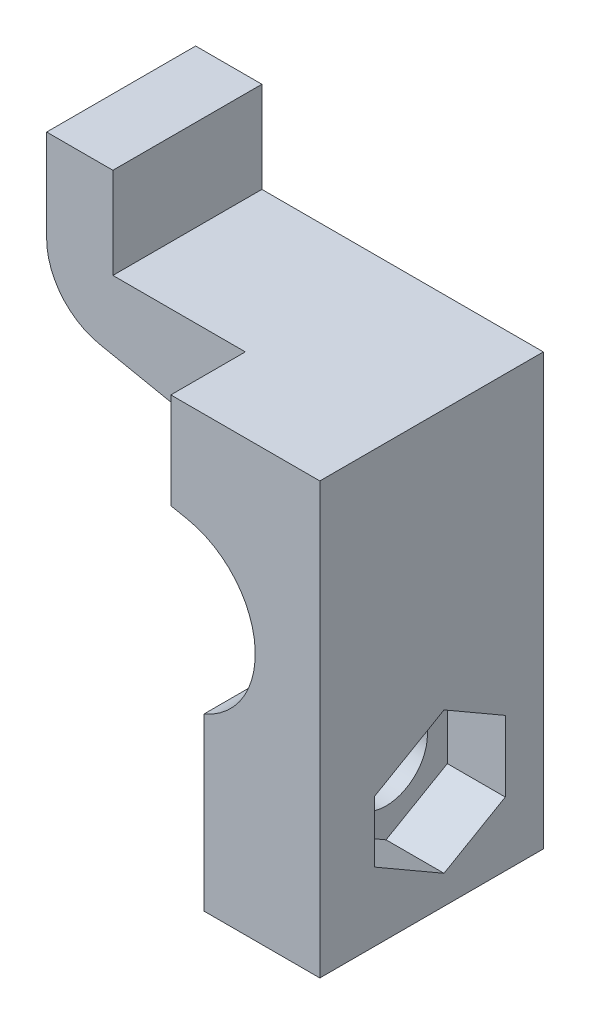
ISO-10303-21;
HEADER;
FILE_DESCRIPTION(('STEP AP214'),'2;1');
FILE_NAME('part.step','',(''),(''),'','','');
FILE_SCHEMA(('AUTOMOTIVE_DESIGN { 1 0 10303 214 1 1 1 1 }'));
ENDSEC;
DATA;
#1=APPLICATION_CONTEXT('core data for automotive mechanical design processes');
#2=APPLICATION_PROTOCOL_DEFINITION('international standard','automotive_design',2000,#1);
#3=PRODUCT_CONTEXT('',#1,'mechanical');
#4=PRODUCT('Part','Part','',(#3));
#5=PRODUCT_RELATED_PRODUCT_CATEGORY('part','',(#4));
#6=PRODUCT_DEFINITION_FORMATION('','',#4);
#7=PRODUCT_DEFINITION_CONTEXT('part definition',#1,'design');
#8=PRODUCT_DEFINITION('design','',#6,#7);
#9=PRODUCT_DEFINITION_SHAPE('','',#8);
#10=(LENGTH_UNIT() NAMED_UNIT(*) SI_UNIT(.MILLI.,.METRE.));
#11=(NAMED_UNIT(*) PLANE_ANGLE_UNIT() SI_UNIT($,.RADIAN.));
#12=(NAMED_UNIT(*) SI_UNIT($,.STERADIAN.) SOLID_ANGLE_UNIT());
#13=UNCERTAINTY_MEASURE_WITH_UNIT(LENGTH_MEASURE(1.E-05),#10,'distance_accuracy_value','');
#14=(GEOMETRIC_REPRESENTATION_CONTEXT(3) GLOBAL_UNCERTAINTY_ASSIGNED_CONTEXT((#13)) GLOBAL_UNIT_ASSIGNED_CONTEXT((#10,
#11,#12)) REPRESENTATION_CONTEXT('',''));
#15=CARTESIAN_POINT('',(0.,0.,0.));
#16=DIRECTION('',(0.,0.,1.));
#17=DIRECTION('',(1.,0.,0.));
#18=AXIS2_PLACEMENT_3D('',#15,#16,#17);
#19=CARTESIAN_POINT('',(0.,-25.5,6.));
#20=DIRECTION('',(1.,0.,0.));
#21=DIRECTION('',(0.,0.,-1.));
#22=AXIS2_PLACEMENT_3D('',#19,#20,#21);
#23=CYLINDRICAL_SURFACE('',#22,2.5);
#24=CARTESIAN_POINT('',(14.,-25.5,6.));
#25=DIRECTION('',(1.,0.,0.));
#26=DIRECTION('',(0.,1.,0.));
#27=AXIS2_PLACEMENT_3D('',#24,#25,#26);
#28=CIRCLE('',#27,2.5);
#29=CARTESIAN_POINT('',(14.,-25.5,3.5));
#30=VERTEX_POINT('',#29);
#31=EDGE_CURVE('E242',#30,#30,#28,.T.);
#32=CARTESIAN_POINT('',(17.5,-25.5,6.));
#33=DIRECTION('',(1.,0.,0.));
#34=DIRECTION('',(0.,0.,-1.));
#35=AXIS2_PLACEMENT_3D('',#32,#33,#34);
#36=CIRCLE('',#35,2.5);
#37=CARTESIAN_POINT('',(17.5,-25.5,3.5));
#38=VERTEX_POINT('',#37);
#39=EDGE_CURVE('E41',#38,#38,#36,.F.);
#40=CARTESIAN_POINT('',(14.,-25.5,3.5));
#41=CARTESIAN_POINT('',(14.0364583333333,-25.5,3.5));
#42=CARTESIAN_POINT('',(14.0729166666667,-25.5,3.5));
#43=CARTESIAN_POINT('',(14.1458333333333,-25.5,3.5));
#44=CARTESIAN_POINT('',(14.1822916666667,-25.5,3.5));
#45=CARTESIAN_POINT('',(14.2552083333333,-25.5,3.5));
#46=CARTESIAN_POINT('',(14.2916666666667,-25.5,3.5));
#47=CARTESIAN_POINT('',(14.3645833333333,-25.5,3.5));
#48=CARTESIAN_POINT('',(14.4010416666667,-25.5,3.5));
#49=CARTESIAN_POINT('',(14.4739583333333,-25.5,3.5));
#50=CARTESIAN_POINT('',(14.5104166666667,-25.5,3.5));
#51=CARTESIAN_POINT('',(14.5833333333333,-25.5,3.5));
#52=CARTESIAN_POINT('',(14.6197916666667,-25.5,3.5));
#53=CARTESIAN_POINT('',(14.6927083333333,-25.5,3.5));
#54=CARTESIAN_POINT('',(14.7291666666667,-25.5,3.5));
#55=CARTESIAN_POINT('',(14.8020833333333,-25.5,3.5));
#56=CARTESIAN_POINT('',(14.8385416666667,-25.5,3.5));
#57=CARTESIAN_POINT('',(14.9114583333333,-25.5,3.5));
#58=CARTESIAN_POINT('',(14.9479166666667,-25.5,3.5));
#59=CARTESIAN_POINT('',(15.0208333333333,-25.5,3.5));
#60=CARTESIAN_POINT('',(15.0572916666667,-25.5,3.5));
#61=CARTESIAN_POINT('',(15.1302083333333,-25.5,3.5));
#62=CARTESIAN_POINT('',(15.1666666666667,-25.5,3.5));
#63=CARTESIAN_POINT('',(15.2395833333333,-25.5,3.5));
#64=CARTESIAN_POINT('',(15.2760416666667,-25.5,3.5));
#65=CARTESIAN_POINT('',(15.3489583333333,-25.5,3.5));
#66=CARTESIAN_POINT('',(15.3854166666667,-25.5,3.5));
#67=CARTESIAN_POINT('',(15.4583333333333,-25.5,3.5));
#68=CARTESIAN_POINT('',(15.4947916666667,-25.5,3.5));
#69=CARTESIAN_POINT('',(15.5677083333333,-25.5,3.5));
#70=CARTESIAN_POINT('',(15.6041666666667,-25.5,3.5));
#71=CARTESIAN_POINT('',(15.6770833333333,-25.5,3.5));
#72=CARTESIAN_POINT('',(15.7135416666667,-25.5,3.5));
#73=CARTESIAN_POINT('',(15.7864583333333,-25.5,3.5));
#74=CARTESIAN_POINT('',(15.8229166666667,-25.5,3.5));
#75=CARTESIAN_POINT('',(15.8958333333333,-25.5,3.5));
#76=CARTESIAN_POINT('',(15.9322916666667,-25.5,3.5));
#77=CARTESIAN_POINT('',(16.0052083333333,-25.5,3.5));
#78=CARTESIAN_POINT('',(16.0416666666667,-25.5,3.5));
#79=CARTESIAN_POINT('',(16.1145833333333,-25.5,3.5));
#80=CARTESIAN_POINT('',(16.1510416666667,-25.5,3.5));
#81=CARTESIAN_POINT('',(16.2239583333333,-25.5,3.5));
#82=CARTESIAN_POINT('',(16.2604166666667,-25.5,3.5));
#83=CARTESIAN_POINT('',(16.3333333333333,-25.5,3.5));
#84=CARTESIAN_POINT('',(16.3697916666667,-25.5,3.5));
#85=CARTESIAN_POINT('',(16.4427083333333,-25.5,3.5));
#86=CARTESIAN_POINT('',(16.4791666666667,-25.5,3.5));
#87=CARTESIAN_POINT('',(16.5520833333333,-25.5,3.5));
#88=CARTESIAN_POINT('',(16.5885416666667,-25.5,3.5));
#89=CARTESIAN_POINT('',(16.6614583333333,-25.5,3.5));
#90=CARTESIAN_POINT('',(16.6979166666667,-25.5,3.5));
#91=CARTESIAN_POINT('',(16.7708333333333,-25.5,3.5));
#92=CARTESIAN_POINT('',(16.8072916666667,-25.5,3.5));
#93=CARTESIAN_POINT('',(16.8802083333333,-25.5,3.5));
#94=CARTESIAN_POINT('',(16.9166666666667,-25.5,3.5));
#95=CARTESIAN_POINT('',(16.9895833333333,-25.5,3.5));
#96=CARTESIAN_POINT('',(17.0260416666667,-25.5,3.5));
#97=CARTESIAN_POINT('',(17.0989583333333,-25.5,3.5));
#98=CARTESIAN_POINT('',(17.1354166666667,-25.5,3.5));
#99=CARTESIAN_POINT('',(17.2083333333333,-25.5,3.5));
#100=CARTESIAN_POINT('',(17.2447916666667,-25.5,3.5));
#101=CARTESIAN_POINT('',(17.3177083333333,-25.5,3.5));
#102=CARTESIAN_POINT('',(17.3541666666667,-25.5,3.5));
#103=CARTESIAN_POINT('',(17.4270833333333,-25.5,3.5));
#104=CARTESIAN_POINT('',(17.4635416666667,-25.5,3.5));
#105=CARTESIAN_POINT('',(17.5,-25.5,3.5));
#106=B_SPLINE_CURVE_WITH_KNOTS('',3,(#40,#41,#42,#43,#44,#45,#46,#47,#48,#49,#50,#51,#52,#53,
#54,#55,#56,#57,#58,#59,#60,#61,#62,#63,#64,#65,#66,#67,#68,#69,#70,#71,#72,#73,#74,#75,#76,#77,
#78,#79,#80,#81,#82,#83,#84,#85,#86,#87,#88,#89,#90,#91,#92,#93,#94,#95,#96,#97,#98,#99,#100,
#101,#102,#103,#104,#105),.UNSPECIFIED.,.F.,.F.,(4,2,2,2,2,2,2,2,2,2,2,2,2,2,2,2,2,2,2,2,2,2,2,
2,2,2,2,2,2,2,2,2,4),(0.,0.109375,0.21875,0.328125,0.4375,0.546875,0.656250000000001,
0.765625000000001,0.875000000000001,0.984374999999999,1.09375,1.203125,1.3125,1.421875,1.53125,
1.640625,1.75,1.859375,1.96875,2.078125,2.1875,2.296875,2.40625,2.515625,2.625,2.734375,2.84375,
2.953125,3.0625,3.171875,3.28125,3.390625,3.5),.UNSPECIFIED.);
#107=EDGE_CURVE('BSEAM37',#30,#38,#106,.T.);
#108=ORIENTED_EDGE('',*,*,#31,.F.);
#109=ORIENTED_EDGE('',*,*,#39,.F.);
#110=ORIENTED_EDGE('',*,*,#107,.T.);
#111=ORIENTED_EDGE('',*,*,#107,.F.);
#112=EDGE_LOOP('',(#108,#110,#109,#111));
#113=FACE_BOUND('',#112,.T.);
#114=ADVANCED_FACE('F37',(#113),#23,.F.);
#115=CARTESIAN_POINT('',(4.,0.,9.));
#116=DIRECTION('',(0.,-1.,0.));
#117=DIRECTION('',(1.,0.,0.));
#118=AXIS2_PLACEMENT_3D('',#115,#116,#117);
#119=PLANE('',#118);
#120=DIRECTION('',(-1.,0.,0.));
#121=VECTOR('',#120,1.);
#122=CARTESIAN_POINT('',(4.,0.,0.));
#123=LINE('',#122,#121);
#124=CARTESIAN_POINT('',(4.,0.,0.));
#125=VERTEX_POINT('',#124);
#126=CARTESIAN_POINT('',(0.,0.,0.));
#127=VERTEX_POINT('',#126);
#128=EDGE_CURVE('E260',#125,#127,#123,.T.);
#129=ORIENTED_EDGE('',*,*,#128,.T.);
#130=DIRECTION('',(0.,0.,-1.));
#131=VECTOR('',#130,1.);
#132=CARTESIAN_POINT('',(0.,0.,9.));
#133=LINE('',#132,#131);
#134=CARTESIAN_POINT('',(0.,0.,9.));
#135=VERTEX_POINT('',#134);
#136=EDGE_CURVE('E11',#135,#127,#133,.T.);
#137=ORIENTED_EDGE('',*,*,#136,.F.);
#138=DIRECTION('',(-1.,0.,0.));
#139=VECTOR('',#138,1.);
#140=CARTESIAN_POINT('',(4.,0.,9.));
#141=LINE('',#140,#139);
#142=CARTESIAN_POINT('',(4.,0.,9.));
#143=VERTEX_POINT('',#142);
#144=EDGE_CURVE('E290',#143,#135,#141,.T.);
#145=ORIENTED_EDGE('',*,*,#144,.F.);
#146=DIRECTION('',(0.,0.,-1.));
#147=VECTOR('',#146,1.);
#148=CARTESIAN_POINT('',(4.,0.,9.));
#149=LINE('',#148,#147);
#150=EDGE_CURVE('E291',#143,#125,#149,.T.);
#151=ORIENTED_EDGE('',*,*,#150,.T.);
#152=EDGE_LOOP('',(#129,#137,#145,#151));
#153=FACE_BOUND('',#152,.T.);
#154=ADVANCED_FACE('F39',(#153),#119,.F.);
#155=CARTESIAN_POINT('',(0.,0.,9.));
#156=DIRECTION('',(1.,0.,0.));
#157=DIRECTION('',(0.,0.,-1.));
#158=AXIS2_PLACEMENT_3D('',#155,#156,#157);
#159=PLANE('',#158);
#160=DIRECTION('',(0.,-1.,0.));
#161=VECTOR('',#160,1.);
#162=CARTESIAN_POINT('',(0.,0.,0.));
#163=LINE('',#162,#161);
#164=CARTESIAN_POINT('',(0.,-5.58071066567437,0.));
#165=VERTEX_POINT('',#164);
#166=EDGE_CURVE('E264',#127,#165,#163,.T.);
#167=ORIENTED_EDGE('',*,*,#166,.T.);
#168=DIRECTION('',(0.,0.,-1.));
#169=VECTOR('',#168,1.);
#170=CARTESIAN_POINT('',(0.,-5.58071066567437,9.));
#171=LINE('',#170,#169);
#172=CARTESIAN_POINT('',(0.,-5.58071066567437,9.));
#173=VERTEX_POINT('',#172);
#174=EDGE_CURVE('E46',#173,#165,#171,.T.);
#175=ORIENTED_EDGE('',*,*,#174,.F.);
#176=DIRECTION('',(0.,-1.,0.));
#177=VECTOR('',#176,1.);
#178=CARTESIAN_POINT('',(0.,0.,9.));
#179=LINE('',#178,#177);
#180=EDGE_CURVE('E322',#135,#173,#179,.T.);
#181=ORIENTED_EDGE('',*,*,#180,.F.);
#182=ORIENTED_EDGE('',*,*,#136,.T.);
#183=EDGE_LOOP('',(#167,#175,#181,#182));
#184=FACE_BOUND('',#183,.T.);
#185=ADVANCED_FACE('F330',(#184),#159,.F.);
#186=CARTESIAN_POINT('',(4.,-5.58071066567437,9.));
#187=DIRECTION('',(0.,0.,-1.));
#188=DIRECTION('',(-1.,0.,0.));
#189=AXIS2_PLACEMENT_3D('',#186,#187,#188);
#190=CYLINDRICAL_SURFACE('',#189,4.);
#191=CARTESIAN_POINT('',(4.,-5.58071066567437,0.));
#192=DIRECTION('',(0.,0.,1.));
#193=DIRECTION('',(1.,0.,0.));
#194=AXIS2_PLACEMENT_3D('',#191,#192,#193);
#195=CIRCLE('',#194,4.);
#196=CARTESIAN_POINT('',(3.20051822169524,-9.5,0.));
#197=VERTEX_POINT('',#196);
#198=EDGE_CURVE('E270',#165,#197,#195,.T.);
#199=ORIENTED_EDGE('',*,*,#198,.T.);
#200=DIRECTION('',(0.,0.,-1.));
#201=VECTOR('',#200,1.);
#202=CARTESIAN_POINT('',(3.20051822169524,-9.5,9.));
#203=LINE('',#202,#201);
#204=CARTESIAN_POINT('',(3.20051822169524,-9.5,9.));
#205=VERTEX_POINT('',#204);
#206=EDGE_CURVE('E311',#205,#197,#203,.T.);
#207=ORIENTED_EDGE('',*,*,#206,.F.);
#208=CARTESIAN_POINT('',(4.,-5.58071066567437,9.));
#209=DIRECTION('',(0.,0.,1.));
#210=DIRECTION('',(1.,0.,0.));
#211=AXIS2_PLACEMENT_3D('',#208,#209,#210);
#212=CIRCLE('',#211,4.);
#213=EDGE_CURVE('E317',#173,#205,#212,.T.);
#214=ORIENTED_EDGE('',*,*,#213,.F.);
#215=ORIENTED_EDGE('',*,*,#174,.T.);
#216=EDGE_LOOP('',(#199,#207,#214,#215));
#217=FACE_BOUND('',#216,.T.);
#218=ADVANCED_FACE('F335',(#217),#190,.T.);
#219=CARTESIAN_POINT('',(3.20051822169524,-9.5,9.));
#220=DIRECTION('',(0.19987044457619,0.979822333581408,0.));
#221=DIRECTION('',(-0.979822333581408,0.19987044457619,0.));
#222=AXIS2_PLACEMENT_3D('',#219,#220,#221);
#223=PLANE('',#222);
#224=DIRECTION('',(0.979822333581408,-0.19987044457619,0.));
#225=VECTOR('',#224,1.);
#226=CARTESIAN_POINT('',(3.20051822169524,-9.5,0.));
#227=LINE('',#226,#225);
#228=CARTESIAN_POINT('',(13.0193392673386,-11.5029060987348,0.));
#229=VERTEX_POINT('',#228);
#230=EDGE_CURVE('E276',#197,#229,#227,.T.);
#231=ORIENTED_EDGE('',*,*,#230,.T.);
#232=DIRECTION('',(0.,0.,-1.));
#233=VECTOR('',#232,1.);
#234=CARTESIAN_POINT('',(13.0193392673386,-11.5029060987348,9.));
#235=LINE('',#234,#233);
#236=CARTESIAN_POINT('',(13.0193392673386,-11.5029060987348,13.5));
#237=VERTEX_POINT('',#236);
#238=EDGE_CURVE('E308',#237,#229,#235,.T.);
#239=ORIENTED_EDGE('',*,*,#238,.F.);
#240=DIRECTION('',(0.979822333581408,-0.199870444576192,0.));
#241=VECTOR('',#240,1.);
#242=CARTESIAN_POINT('',(12.,-11.2949747365334,13.5));
#243=LINE('',#242,#241);
#244=CARTESIAN_POINT('',(12.,-11.2949747365334,13.5));
#245=VERTEX_POINT('',#244);
#246=EDGE_CURVE('E224',#245,#237,#243,.T.);
#247=ORIENTED_EDGE('',*,*,#246,.F.);
#248=DIRECTION('',(0.,0.,-1.));
#249=VECTOR('',#248,1.);
#250=CARTESIAN_POINT('',(12.,-11.2949747365334,13.5));
#251=LINE('',#250,#249);
#252=CARTESIAN_POINT('',(12.,-11.2949747365334,9.));
#253=VERTEX_POINT('',#252);
#254=EDGE_CURVE('E239',#245,#253,#251,.T.);
#255=ORIENTED_EDGE('',*,*,#254,.T.);
#256=DIRECTION('',(0.979822333581408,-0.19987044457619,0.));
#257=VECTOR('',#256,1.);
#258=CARTESIAN_POINT('',(3.20051822169524,-9.5,9.));
#259=LINE('',#258,#257);
#260=EDGE_CURVE('E315',#205,#253,#259,.T.);
#261=ORIENTED_EDGE('',*,*,#260,.F.);
#262=ORIENTED_EDGE('',*,*,#206,.T.);
#263=EDGE_LOOP('',(#231,#239,#247,#255,#261,#262));
#264=FACE_BOUND('',#263,.T.);
#265=ADVANCED_FACE('F341',(#264),#223,.F.);
#266=CARTESIAN_POINT('',(12.,-16.5,9.));
#267=DIRECTION('',(0.,0.,-1.));
#268=DIRECTION('',(-1.,0.,0.));
#269=AXIS2_PLACEMENT_3D('',#266,#267,#268);
#270=CYLINDRICAL_SURFACE('',#269,5.1);
#271=CARTESIAN_POINT('',(12.,-16.5,0.));
#272=DIRECTION('',(0.,0.,-1.));
#273=DIRECTION('',(1.,0.,0.));
#274=AXIS2_PLACEMENT_3D('',#271,#272,#273);
#275=CIRCLE('',#274,5.1);
#276=CARTESIAN_POINT('',(14.,-21.191481642296,0.));
#277=VERTEX_POINT('',#276);
#278=EDGE_CURVE('E278',#229,#277,#275,.T.);
#279=ORIENTED_EDGE('',*,*,#278,.T.);
#280=DIRECTION('',(0.,0.,-1.));
#281=VECTOR('',#280,1.);
#282=CARTESIAN_POINT('',(14.,-21.191481642296,9.));
#283=LINE('',#282,#281);
#284=CARTESIAN_POINT('',(14.,-21.191481642296,13.5));
#285=VERTEX_POINT('',#284);
#286=EDGE_CURVE('E305',#285,#277,#283,.T.);
#287=ORIENTED_EDGE('',*,*,#286,.F.);
#288=CARTESIAN_POINT('',(12.,-16.5,13.5));
#289=DIRECTION('',(0.,0.,-1.));
#290=DIRECTION('',(1.,0.,0.));
#291=AXIS2_PLACEMENT_3D('',#288,#289,#290);
#292=CIRCLE('',#291,5.1);
#293=EDGE_CURVE('E227',#237,#285,#292,.T.);
#294=ORIENTED_EDGE('',*,*,#293,.F.);
#295=ORIENTED_EDGE('',*,*,#238,.T.);
#296=EDGE_LOOP('',(#279,#287,#294,#295));
#297=FACE_BOUND('',#296,.T.);
#298=ADVANCED_FACE('F347',(#297),#270,.F.);
#299=CARTESIAN_POINT('',(14.,-21.191481642296,9.));
#300=DIRECTION('',(1.,0.,0.));
#301=DIRECTION('',(0.,1.,0.));
#302=AXIS2_PLACEMENT_3D('',#299,#300,#301);
#303=PLANE('',#302);
#304=ORIENTED_EDGE('',*,*,#31,.T.);
#305=EDGE_LOOP('',(#304));
#306=FACE_BOUND('',#305,.T.);
#307=DIRECTION('',(0.,-1.,0.));
#308=VECTOR('',#307,1.);
#309=CARTESIAN_POINT('',(14.,-21.191481642296,0.));
#310=LINE('',#309,#308);
#311=CARTESIAN_POINT('',(14.,-31.5,0.));
#312=VERTEX_POINT('',#311);
#313=EDGE_CURVE('E280',#277,#312,#310,.T.);
#314=ORIENTED_EDGE('',*,*,#313,.T.);
#315=DIRECTION('',(0.,0.,-1.));
#316=VECTOR('',#315,1.);
#317=CARTESIAN_POINT('',(14.,-31.5,9.));
#318=LINE('',#317,#316);
#319=CARTESIAN_POINT('',(14.,-31.5,13.5));
#320=VERTEX_POINT('',#319);
#321=EDGE_CURVE('E302',#320,#312,#318,.T.);
#322=ORIENTED_EDGE('',*,*,#321,.F.);
#323=DIRECTION('',(0.,-1.,0.));
#324=VECTOR('',#323,1.);
#325=CARTESIAN_POINT('',(14.,-21.191481642296,13.5));
#326=LINE('',#325,#324);
#327=EDGE_CURVE('E230',#285,#320,#326,.T.);
#328=ORIENTED_EDGE('',*,*,#327,.F.);
#329=ORIENTED_EDGE('',*,*,#286,.T.);
#330=EDGE_LOOP('',(#314,#322,#328,#329));
#331=FACE_BOUND('',#330,.T.);
#332=ADVANCED_FACE('F351',(#306,#331),#303,.F.);
#333=CARTESIAN_POINT('',(14.,-31.5,9.));
#334=DIRECTION('',(0.,1.,0.));
#335=DIRECTION('',(0.,0.,1.));
#336=AXIS2_PLACEMENT_3D('',#333,#334,#335);
#337=PLANE('',#336);
#338=DIRECTION('',(1.,0.,0.));
#339=VECTOR('',#338,1.);
#340=CARTESIAN_POINT('',(14.,-31.5,0.));
#341=LINE('',#340,#339);
#342=CARTESIAN_POINT('',(21.,-31.5,0.));
#343=VERTEX_POINT('',#342);
#344=EDGE_CURVE('E282',#312,#343,#341,.T.);
#345=ORIENTED_EDGE('',*,*,#344,.T.);
#346=DIRECTION('',(0.,0.,-1.));
#347=VECTOR('',#346,1.);
#348=CARTESIAN_POINT('',(21.,-31.5,9.));
#349=LINE('',#348,#347);
#350=CARTESIAN_POINT('',(21.,-31.5,13.5));
#351=VERTEX_POINT('',#350);
#352=EDGE_CURVE('E299',#351,#343,#349,.T.);
#353=ORIENTED_EDGE('',*,*,#352,.F.);
#354=DIRECTION('',(1.,0.,0.));
#355=VECTOR('',#354,1.);
#356=CARTESIAN_POINT('',(14.,-31.5,13.5));
#357=LINE('',#356,#355);
#358=EDGE_CURVE('E233',#320,#351,#357,.T.);
#359=ORIENTED_EDGE('',*,*,#358,.F.);
#360=ORIENTED_EDGE('',*,*,#321,.T.);
#361=EDGE_LOOP('',(#345,#353,#359,#360));
#362=FACE_BOUND('',#361,.T.);
#363=ADVANCED_FACE('F359',(#362),#337,.F.);
#364=CARTESIAN_POINT('',(21.,-31.5,9.));
#365=DIRECTION('',(-1.,0.,0.));
#366=DIRECTION('',(0.,0.,1.));
#367=AXIS2_PLACEMENT_3D('',#364,#365,#366);
#368=PLANE('',#367);
#369=DIRECTION('',(0.,0.5,0.866025403784439));
#370=VECTOR('',#369,1.);
#371=CARTESIAN_POINT('',(21.,-23.3638040039984,2.3));
#372=LINE('',#371,#370);
#373=CARTESIAN_POINT('',(21.,-23.3638040039984,2.3));
#374=VERTEX_POINT('',#373);
#375=CARTESIAN_POINT('',(21.,-21.2276080079968,6.));
#376=VERTEX_POINT('',#375);
#377=EDGE_CURVE('E200',#374,#376,#372,.T.);
#378=ORIENTED_EDGE('',*,*,#377,.F.);
#379=DIRECTION('',(0.,1.,0.));
#380=VECTOR('',#379,1.);
#381=CARTESIAN_POINT('',(21.,-27.6361959960016,2.3));
#382=LINE('',#381,#380);
#383=CARTESIAN_POINT('',(21.,-27.6361959960016,2.3));
#384=VERTEX_POINT('',#383);
#385=EDGE_CURVE('E54',#384,#374,#382,.T.);
#386=ORIENTED_EDGE('',*,*,#385,.F.);
#387=DIRECTION('',(0.,0.5,-0.866025403784439));
#388=VECTOR('',#387,1.);
#389=CARTESIAN_POINT('',(21.,-29.7723919920032,6.));
#390=LINE('',#389,#388);
#391=CARTESIAN_POINT('',(21.,-29.7723919920032,6.));
#392=VERTEX_POINT('',#391);
#393=EDGE_CURVE('E186',#392,#384,#390,.T.);
#394=ORIENTED_EDGE('',*,*,#393,.F.);
#395=DIRECTION('',(0.,-0.5,-0.866025403784439));
#396=VECTOR('',#395,1.);
#397=CARTESIAN_POINT('',(21.,-27.3475208614068,10.2));
#398=LINE('',#397,#396);
#399=CARTESIAN_POINT('',(21.,-27.3475208614068,10.2));
#400=VERTEX_POINT('',#399);
#401=EDGE_CURVE('E189',#400,#392,#398,.T.);
#402=ORIENTED_EDGE('',*,*,#401,.F.);
#403=DIRECTION('',(0.,-1.,0.));
#404=VECTOR('',#403,1.);
#405=CARTESIAN_POINT('',(21.,-23.6524791385932,10.2));
#406=LINE('',#405,#404);
#407=CARTESIAN_POINT('',(21.,-23.6524791385932,10.2));
#408=VERTEX_POINT('',#407);
#409=EDGE_CURVE('E205',#408,#400,#406,.T.);
#410=ORIENTED_EDGE('',*,*,#409,.F.);
#411=DIRECTION('',(0.,-0.5,0.866025403784439));
#412=VECTOR('',#411,1.);
#413=CARTESIAN_POINT('',(21.,-21.2276080079968,6.));
#414=LINE('',#413,#412);
#415=EDGE_CURVE('E202',#376,#408,#414,.T.);
#416=ORIENTED_EDGE('',*,*,#415,.F.);
#417=EDGE_LOOP('',(#378,#386,#394,#402,#410,#416));
#418=FACE_BOUND('',#417,.T.);
#419=DIRECTION('',(0.,1.,0.));
#420=VECTOR('',#419,1.);
#421=CARTESIAN_POINT('',(21.,-31.5,0.));
#422=LINE('',#421,#420);
#423=CARTESIAN_POINT('',(21.,-5.5,0.));
#424=VERTEX_POINT('',#423);
#425=EDGE_CURVE('E284',#343,#424,#422,.T.);
#426=ORIENTED_EDGE('',*,*,#425,.T.);
#427=DIRECTION('',(0.,0.,-1.));
#428=VECTOR('',#427,1.);
#429=CARTESIAN_POINT('',(21.,-5.5,9.));
#430=LINE('',#429,#428);
#431=CARTESIAN_POINT('',(21.,-5.5,13.5));
#432=VERTEX_POINT('',#431);
#433=EDGE_CURVE('E296',#432,#424,#430,.T.);
#434=ORIENTED_EDGE('',*,*,#433,.F.);
#435=DIRECTION('',(0.,1.,0.));
#436=VECTOR('',#435,1.);
#437=CARTESIAN_POINT('',(21.,-31.5,13.5));
#438=LINE('',#437,#436);
#439=EDGE_CURVE('E236',#351,#432,#438,.T.);
#440=ORIENTED_EDGE('',*,*,#439,.F.);
#441=ORIENTED_EDGE('',*,*,#352,.T.);
#442=EDGE_LOOP('',(#426,#434,#440,#441));
#443=FACE_BOUND('',#442,.T.);
#444=ADVANCED_FACE('F363',(#418,#443),#368,.F.);
#445=CARTESIAN_POINT('',(21.,-5.5,9.));
#446=DIRECTION('',(0.,-1.,0.));
#447=DIRECTION('',(1.,0.,0.));
#448=AXIS2_PLACEMENT_3D('',#445,#446,#447);
#449=PLANE('',#448);
#450=DIRECTION('',(-1.,0.,0.));
#451=VECTOR('',#450,1.);
#452=CARTESIAN_POINT('',(21.,-5.5,0.));
#453=LINE('',#452,#451);
#454=CARTESIAN_POINT('',(4.,-5.5,0.));
#455=VERTEX_POINT('',#454);
#456=EDGE_CURVE('E286',#424,#455,#453,.T.);
#457=ORIENTED_EDGE('',*,*,#456,.T.);
#458=DIRECTION('',(0.,0.,-1.));
#459=VECTOR('',#458,1.);
#460=CARTESIAN_POINT('',(4.,-5.5,9.));
#461=LINE('',#460,#459);
#462=CARTESIAN_POINT('',(4.,-5.5,9.));
#463=VERTEX_POINT('',#462);
#464=EDGE_CURVE('E293',#463,#455,#461,.T.);
#465=ORIENTED_EDGE('',*,*,#464,.F.);
#466=DIRECTION('',(-1.,0.,0.));
#467=VECTOR('',#466,1.);
#468=CARTESIAN_POINT('',(21.,-5.5,9.));
#469=LINE('',#468,#467);
#470=CARTESIAN_POINT('',(12.,-5.5,9.));
#471=VERTEX_POINT('',#470);
#472=EDGE_CURVE('E247',#471,#463,#469,.T.);
#473=ORIENTED_EDGE('',*,*,#472,.F.);
#474=DIRECTION('',(0.,0.,-1.));
#475=VECTOR('',#474,1.);
#476=CARTESIAN_POINT('',(12.,-5.5,13.5));
#477=LINE('',#476,#475);
#478=CARTESIAN_POINT('',(12.,-5.5,13.5));
#479=VERTEX_POINT('',#478);
#480=EDGE_CURVE('E252',#479,#471,#477,.T.);
#481=ORIENTED_EDGE('',*,*,#480,.F.);
#482=DIRECTION('',(-1.,0.,0.));
#483=VECTOR('',#482,1.);
#484=CARTESIAN_POINT('',(21.,-5.5,13.5));
#485=LINE('',#484,#483);
#486=EDGE_CURVE('E219',#432,#479,#485,.T.);
#487=ORIENTED_EDGE('',*,*,#486,.F.);
#488=ORIENTED_EDGE('',*,*,#433,.T.);
#489=EDGE_LOOP('',(#457,#465,#473,#481,#487,#488));
#490=FACE_BOUND('',#489,.T.);
#491=ADVANCED_FACE('F366',(#490),#449,.F.);
#492=CARTESIAN_POINT('',(4.,-5.5,9.));
#493=DIRECTION('',(-1.,0.,0.));
#494=DIRECTION('',(0.,0.,1.));
#495=AXIS2_PLACEMENT_3D('',#492,#493,#494);
#496=PLANE('',#495);
#497=DIRECTION('',(0.,1.,0.));
#498=VECTOR('',#497,1.);
#499=CARTESIAN_POINT('',(4.,-5.5,0.));
#500=LINE('',#499,#498);
#501=EDGE_CURVE('E288',#455,#125,#500,.T.);
#502=ORIENTED_EDGE('',*,*,#501,.T.);
#503=ORIENTED_EDGE('',*,*,#150,.F.);
#504=DIRECTION('',(0.,1.,0.));
#505=VECTOR('',#504,1.);
#506=CARTESIAN_POINT('',(4.,-5.5,9.));
#507=LINE('',#506,#505);
#508=EDGE_CURVE('E273',#463,#143,#507,.T.);
#509=ORIENTED_EDGE('',*,*,#508,.F.);
#510=ORIENTED_EDGE('',*,*,#464,.T.);
#511=EDGE_LOOP('',(#502,#503,#509,#510));
#512=FACE_BOUND('',#511,.T.);
#513=ADVANCED_FACE('F370',(#512),#496,.F.);
#514=CARTESIAN_POINT('',(4.,-5.58071066567437,9.));
#515=DIRECTION('',(0.,0.,1.));
#516=DIRECTION('',(1.,0.,0.));
#517=AXIS2_PLACEMENT_3D('',#514,#515,#516);
#518=PLANE('',#517);
#519=DIRECTION('',(0.,-1.,0.));
#520=VECTOR('',#519,1.);
#521=CARTESIAN_POINT('',(12.,-5.5,9.));
#522=LINE('',#521,#520);
#523=EDGE_CURVE('E62',#471,#253,#522,.T.);
#524=ORIENTED_EDGE('',*,*,#523,.F.);
#525=ORIENTED_EDGE('',*,*,#472,.T.);
#526=ORIENTED_EDGE('',*,*,#508,.T.);
#527=ORIENTED_EDGE('',*,*,#144,.T.);
#528=ORIENTED_EDGE('',*,*,#180,.T.);
#529=ORIENTED_EDGE('',*,*,#213,.T.);
#530=ORIENTED_EDGE('',*,*,#260,.T.);
#531=EDGE_LOOP('',(#524,#525,#526,#527,#528,#529,#530));
#532=FACE_BOUND('',#531,.T.);
#533=ADVANCED_FACE('F325',(#532),#518,.T.);
#534=CARTESIAN_POINT('',(4.,-5.58071066567437,0.));
#535=DIRECTION('',(0.,0.,1.));
#536=DIRECTION('',(1.,0.,0.));
#537=AXIS2_PLACEMENT_3D('',#534,#535,#536);
#538=PLANE('',#537);
#539=ORIENTED_EDGE('',*,*,#128,.F.);
#540=ORIENTED_EDGE('',*,*,#501,.F.);
#541=ORIENTED_EDGE('',*,*,#456,.F.);
#542=ORIENTED_EDGE('',*,*,#425,.F.);
#543=ORIENTED_EDGE('',*,*,#344,.F.);
#544=ORIENTED_EDGE('',*,*,#313,.F.);
#545=ORIENTED_EDGE('',*,*,#278,.F.);
#546=ORIENTED_EDGE('',*,*,#230,.F.);
#547=ORIENTED_EDGE('',*,*,#198,.F.);
#548=ORIENTED_EDGE('',*,*,#166,.F.);
#549=EDGE_LOOP('',(#539,#540,#541,#542,#543,#544,#545,#546,#547,#548));
#550=FACE_BOUND('',#549,.T.);
#551=ADVANCED_FACE('F354',(#550),#538,.F.);
#552=CARTESIAN_POINT('',(12.,-5.5,13.5));
#553=DIRECTION('',(1.,0.,0.));
#554=DIRECTION('',(0.,0.,-1.));
#555=AXIS2_PLACEMENT_3D('',#552,#553,#554);
#556=PLANE('',#555);
#557=ORIENTED_EDGE('',*,*,#523,.T.);
#558=ORIENTED_EDGE('',*,*,#254,.F.);
#559=DIRECTION('',(0.,-1.,0.));
#560=VECTOR('',#559,1.);
#561=CARTESIAN_POINT('',(12.,-5.5,13.5));
#562=LINE('',#561,#560);
#563=EDGE_CURVE('E222',#479,#245,#562,.T.);
#564=ORIENTED_EDGE('',*,*,#563,.F.);
#565=ORIENTED_EDGE('',*,*,#480,.T.);
#566=EDGE_LOOP('',(#557,#558,#564,#565));
#567=FACE_BOUND('',#566,.T.);
#568=ADVANCED_FACE('F339',(#567),#556,.F.);
#569=CARTESIAN_POINT('',(12.,-16.5,13.5));
#570=DIRECTION('',(0.,0.,1.));
#571=DIRECTION('',(1.,0.,0.));
#572=AXIS2_PLACEMENT_3D('',#569,#570,#571);
#573=PLANE('',#572);
#574=ORIENTED_EDGE('',*,*,#486,.T.);
#575=ORIENTED_EDGE('',*,*,#563,.T.);
#576=ORIENTED_EDGE('',*,*,#246,.T.);
#577=ORIENTED_EDGE('',*,*,#293,.T.);
#578=ORIENTED_EDGE('',*,*,#327,.T.);
#579=ORIENTED_EDGE('',*,*,#358,.T.);
#580=ORIENTED_EDGE('',*,*,#439,.T.);
#581=EDGE_LOOP('',(#574,#575,#576,#577,#578,#579,#580));
#582=FACE_BOUND('',#581,.T.);
#583=ADVANCED_FACE('F344',(#582),#573,.T.);
#584=CARTESIAN_POINT('',(17.5,-23.3638040039984,2.3));
#585=DIRECTION('',(1.,0.,0.));
#586=DIRECTION('',(0.,0.,-1.));
#587=AXIS2_PLACEMENT_3D('',#584,#585,#586);
#588=PLANE('',#587);
#589=DIRECTION('',(0.,1.,0.));
#590=VECTOR('',#589,1.);
#591=CARTESIAN_POINT('',(17.5,-27.6361959960016,2.3));
#592=LINE('',#591,#590);
#593=CARTESIAN_POINT('',(17.5,-27.6361959960016,2.3));
#594=VERTEX_POINT('',#593);
#595=CARTESIAN_POINT('',(17.5,-23.3638040039984,2.3));
#596=VERTEX_POINT('',#595);
#597=EDGE_CURVE('E166',#594,#596,#592,.T.);
#598=ORIENTED_EDGE('',*,*,#597,.T.);
#599=DIRECTION('',(0.,0.5,0.866025403784439));
#600=VECTOR('',#599,1.);
#601=CARTESIAN_POINT('',(17.5,-23.3638040039984,2.3));
#602=LINE('',#601,#600);
#603=CARTESIAN_POINT('',(17.5,-21.2276080079968,6.));
#604=VERTEX_POINT('',#603);
#605=EDGE_CURVE('E175',#596,#604,#602,.T.);
#606=ORIENTED_EDGE('',*,*,#605,.T.);
#607=DIRECTION('',(0.,-0.5,0.866025403784439));
#608=VECTOR('',#607,1.);
#609=CARTESIAN_POINT('',(17.5,-21.2276080079968,6.));
#610=LINE('',#609,#608);
#611=CARTESIAN_POINT('',(17.5,-23.6524791385932,10.2));
#612=VERTEX_POINT('',#611);
#613=EDGE_CURVE('E180',#604,#612,#610,.T.);
#614=ORIENTED_EDGE('',*,*,#613,.T.);
#615=DIRECTION('',(0.,-1.,0.));
#616=VECTOR('',#615,1.);
#617=CARTESIAN_POINT('',(17.5,-23.6524791385932,10.2));
#618=LINE('',#617,#616);
#619=CARTESIAN_POINT('',(17.5,-27.3475208614068,10.2));
#620=VERTEX_POINT('',#619);
#621=EDGE_CURVE('E193',#612,#620,#618,.T.);
#622=ORIENTED_EDGE('',*,*,#621,.T.);
#623=DIRECTION('',(0.,-0.5,-0.866025403784439));
#624=VECTOR('',#623,1.);
#625=CARTESIAN_POINT('',(17.5,-27.3475208614068,10.2));
#626=LINE('',#625,#624);
#627=CARTESIAN_POINT('',(17.5,-29.7723919920032,6.));
#628=VERTEX_POINT('',#627);
#629=EDGE_CURVE('E196',#620,#628,#626,.T.);
#630=ORIENTED_EDGE('',*,*,#629,.T.);
#631=DIRECTION('',(0.,0.5,-0.866025403784439));
#632=VECTOR('',#631,1.);
#633=CARTESIAN_POINT('',(17.5,-29.7723919920032,6.));
#634=LINE('',#633,#632);
#635=EDGE_CURVE('E172',#628,#594,#634,.T.);
#636=ORIENTED_EDGE('',*,*,#635,.T.);
#637=EDGE_LOOP('',(#598,#606,#614,#622,#630,#636));
#638=FACE_BOUND('',#637,.T.);
#639=ORIENTED_EDGE('',*,*,#39,.T.);
#640=EDGE_LOOP('',(#639));
#641=FACE_BOUND('',#640,.T.);
#642=ADVANCED_FACE('F182',(#638,#641),#588,.T.);
#643=CARTESIAN_POINT('',(17.5,-27.6361959960016,2.3));
#644=DIRECTION('',(0.,0.,-1.));
#645=DIRECTION('',(-1.,0.,0.));
#646=AXIS2_PLACEMENT_3D('',#643,#644,#645);
#647=PLANE('',#646);
#648=ORIENTED_EDGE('',*,*,#385,.T.);
#649=DIRECTION('',(1.,0.,0.));
#650=VECTOR('',#649,1.);
#651=CARTESIAN_POINT('',(17.5,-23.3638040039984,2.3));
#652=LINE('',#651,#650);
#653=EDGE_CURVE('E162',#596,#374,#652,.T.);
#654=ORIENTED_EDGE('',*,*,#653,.F.);
#655=ORIENTED_EDGE('',*,*,#597,.F.);
#656=DIRECTION('',(1.,0.,0.));
#657=VECTOR('',#656,1.);
#658=CARTESIAN_POINT('',(17.5,-27.6361959960016,2.3));
#659=LINE('',#658,#657);
#660=EDGE_CURVE('E210',#594,#384,#659,.T.);
#661=ORIENTED_EDGE('',*,*,#660,.T.);
#662=EDGE_LOOP('',(#648,#654,#655,#661));
#663=FACE_BOUND('',#662,.T.);
#664=ADVANCED_FACE('F164',(#663),#647,.F.);
#665=CARTESIAN_POINT('',(17.5,-29.7723919920032,6.));
#666=DIRECTION('',(0.,-0.866025403784439,-0.5));
#667=DIRECTION('',(0.,0.5,-0.866025403784439));
#668=AXIS2_PLACEMENT_3D('',#665,#666,#667);
#669=PLANE('',#668);
#670=ORIENTED_EDGE('',*,*,#393,.T.);
#671=ORIENTED_EDGE('',*,*,#660,.F.);
#672=ORIENTED_EDGE('',*,*,#635,.F.);
#673=DIRECTION('',(1.,0.,0.));
#674=VECTOR('',#673,1.);
#675=CARTESIAN_POINT('',(17.5,-29.7723919920032,6.));
#676=LINE('',#675,#674);
#677=EDGE_CURVE('E212',#628,#392,#676,.T.);
#678=ORIENTED_EDGE('',*,*,#677,.T.);
#679=EDGE_LOOP('',(#670,#671,#672,#678));
#680=FACE_BOUND('',#679,.T.);
#681=ADVANCED_FACE('F403',(#680),#669,.F.);
#682=CARTESIAN_POINT('',(17.5,-27.3475208614068,10.2));
#683=DIRECTION('',(0.,-0.866025403784438,0.5));
#684=DIRECTION('',(0.,-0.5,-0.866025403784439));
#685=AXIS2_PLACEMENT_3D('',#682,#683,#684);
#686=PLANE('',#685);
#687=ORIENTED_EDGE('',*,*,#401,.T.);
#688=ORIENTED_EDGE('',*,*,#677,.F.);
#689=ORIENTED_EDGE('',*,*,#629,.F.);
#690=DIRECTION('',(1.,0.,0.));
#691=VECTOR('',#690,1.);
#692=CARTESIAN_POINT('',(17.5,-27.3475208614068,10.2));
#693=LINE('',#692,#691);
#694=EDGE_CURVE('E214',#620,#400,#693,.T.);
#695=ORIENTED_EDGE('',*,*,#694,.T.);
#696=EDGE_LOOP('',(#687,#688,#689,#695));
#697=FACE_BOUND('',#696,.T.);
#698=ADVANCED_FACE('F413',(#697),#686,.F.);
#699=CARTESIAN_POINT('',(17.5,-23.6524791385932,10.2));
#700=DIRECTION('',(0.,0.,1.));
#701=DIRECTION('',(1.,0.,0.));
#702=AXIS2_PLACEMENT_3D('',#699,#700,#701);
#703=PLANE('',#702);
#704=ORIENTED_EDGE('',*,*,#409,.T.);
#705=ORIENTED_EDGE('',*,*,#694,.F.);
#706=ORIENTED_EDGE('',*,*,#621,.F.);
#707=DIRECTION('',(1.,0.,0.));
#708=VECTOR('',#707,1.);
#709=CARTESIAN_POINT('',(17.5,-23.6524791385932,10.2));
#710=LINE('',#709,#708);
#711=EDGE_CURVE('E216',#612,#408,#710,.T.);
#712=ORIENTED_EDGE('',*,*,#711,.T.);
#713=EDGE_LOOP('',(#704,#705,#706,#712));
#714=FACE_BOUND('',#713,.T.);
#715=ADVANCED_FACE('F409',(#714),#703,.F.);
#716=CARTESIAN_POINT('',(17.5,-21.2276080079968,6.));
#717=DIRECTION('',(0.,0.866025403784439,0.5));
#718=DIRECTION('',(0.,-0.5,0.866025403784439));
#719=AXIS2_PLACEMENT_3D('',#716,#717,#718);
#720=PLANE('',#719);
#721=ORIENTED_EDGE('',*,*,#415,.T.);
#722=ORIENTED_EDGE('',*,*,#711,.F.);
#723=ORIENTED_EDGE('',*,*,#613,.F.);
#724=DIRECTION('',(1.,0.,0.));
#725=VECTOR('',#724,1.);
#726=CARTESIAN_POINT('',(17.5,-21.2276080079968,6.));
#727=LINE('',#726,#725);
#728=EDGE_CURVE('E171',#604,#376,#727,.T.);
#729=ORIENTED_EDGE('',*,*,#728,.T.);
#730=EDGE_LOOP('',(#721,#722,#723,#729));
#731=FACE_BOUND('',#730,.T.);
#732=ADVANCED_FACE('F406',(#731),#720,.F.);
#733=CARTESIAN_POINT('',(17.5,-23.3638040039984,2.3));
#734=DIRECTION('',(0.,0.866025403784439,-0.5));
#735=DIRECTION('',(0.,0.5,0.866025403784439));
#736=AXIS2_PLACEMENT_3D('',#733,#734,#735);
#737=PLANE('',#736);
#738=ORIENTED_EDGE('',*,*,#377,.T.);
#739=ORIENTED_EDGE('',*,*,#728,.F.);
#740=ORIENTED_EDGE('',*,*,#605,.F.);
#741=ORIENTED_EDGE('',*,*,#653,.T.);
#742=EDGE_LOOP('',(#738,#739,#740,#741));
#743=FACE_BOUND('',#742,.T.);
#744=ADVANCED_FACE('F176',(#743),#737,.F.);
#745=CLOSED_SHELL('',(#114,#154,#185,#218,#265,#298,#332,#363,#444,#491,#513,#533,#551,#568,
#583,#642,#664,#681,#698,#715,#732,#744));
#746=MANIFOLD_SOLID_BREP('B2',#745);
#747=ADVANCED_BREP_SHAPE_REPRESENTATION('',(#18,#746),#14);
#748=SHAPE_DEFINITION_REPRESENTATION(#9,#747);
ENDSEC;
END-ISO-10303-21;
